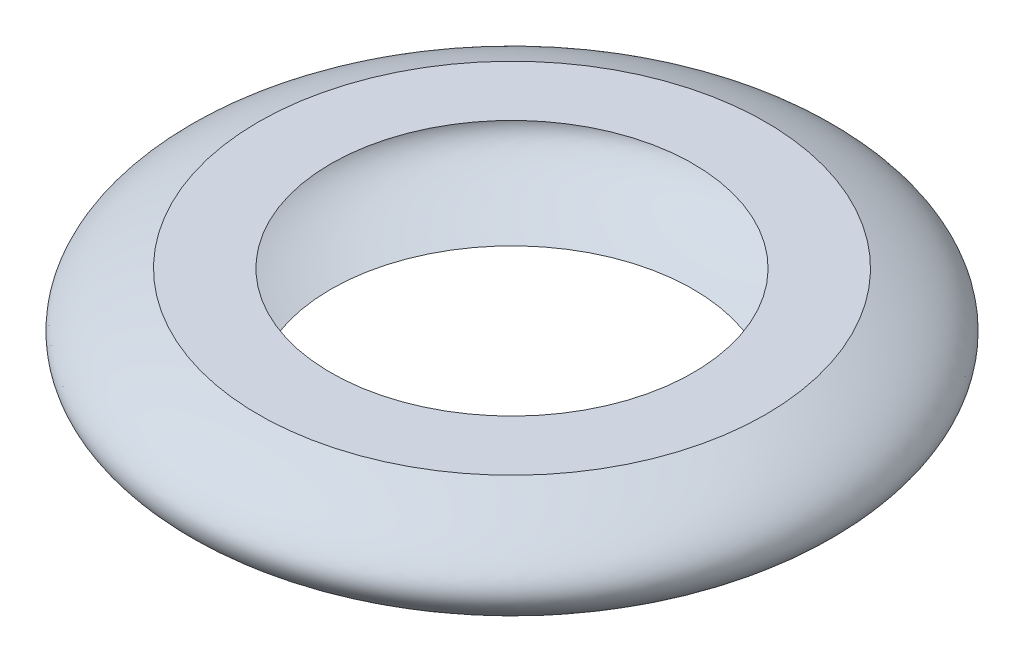
ISO-10303-21;
HEADER;
FILE_DESCRIPTION(('STEP AP214'),'2;1');
FILE_NAME('part.step','',(''),(''),'','','');
FILE_SCHEMA(('AUTOMOTIVE_DESIGN { 1 0 10303 214 1 1 1 1 }'));
ENDSEC;
DATA;
#1=APPLICATION_CONTEXT('core data for automotive mechanical design processes');
#2=APPLICATION_PROTOCOL_DEFINITION('international standard','automotive_design',2000,#1);
#3=PRODUCT_CONTEXT('',#1,'mechanical');
#4=PRODUCT('Part','Part','',(#3));
#5=PRODUCT_RELATED_PRODUCT_CATEGORY('part','',(#4));
#6=PRODUCT_DEFINITION_FORMATION('','',#4);
#7=PRODUCT_DEFINITION_CONTEXT('part definition',#1,'design');
#8=PRODUCT_DEFINITION('design','',#6,#7);
#9=PRODUCT_DEFINITION_SHAPE('','',#8);
#10=(LENGTH_UNIT() NAMED_UNIT(*) SI_UNIT(.MILLI.,.METRE.));
#11=(NAMED_UNIT(*) PLANE_ANGLE_UNIT() SI_UNIT($,.RADIAN.));
#12=(NAMED_UNIT(*) SI_UNIT($,.STERADIAN.) SOLID_ANGLE_UNIT());
#13=UNCERTAINTY_MEASURE_WITH_UNIT(LENGTH_MEASURE(1.E-05),#10,'distance_accuracy_value','');
#14=(GEOMETRIC_REPRESENTATION_CONTEXT(3) GLOBAL_UNCERTAINTY_ASSIGNED_CONTEXT((#13)) GLOBAL_UNIT_ASSIGNED_CONTEXT((#10,
#11,#12)) REPRESENTATION_CONTEXT('',''));
#15=CARTESIAN_POINT('',(0.,0.,0.));
#16=DIRECTION('',(0.,0.,1.));
#17=DIRECTION('',(1.,0.,0.));
#18=AXIS2_PLACEMENT_3D('',#15,#16,#17);
#19=CARTESIAN_POINT('',(-12.5,0.,0.));
#20=CARTESIAN_POINT('',(-23.,3.75,0.));
#21=CARTESIAN_POINT('',(-12.5,7.5,0.));
#22=B_SPLINE_CURVE_WITH_KNOTS('',2,(#19,#20,#21),.UNSPECIFIED.,.F.,.F.,(3,3),(0.,1.),.UNSPECIFIED.);
#23=CARTESIAN_POINT('',(0.,7.50000000000001,0.));
#24=DIRECTION('',(0.,1.,0.));
#25=AXIS1_PLACEMENT('',#23,#24);
#26=SURFACE_OF_REVOLUTION('',#22,#25);
#27=CARTESIAN_POINT('',(0.,7.50000000000001,0.));
#28=DIRECTION('',(0.,1.,0.));
#29=DIRECTION('',(-1.,0.,0.));
#30=AXIS2_PLACEMENT_3D('',#27,#28,#29);
#31=CIRCLE('',#30,12.5);
#32=CARTESIAN_POINT('',(-12.5,7.5,0.));
#33=VERTEX_POINT('',#32);
#34=EDGE_CURVE('E10',#33,#33,#31,.T.);
#35=ORIENTED_EDGE('',*,*,#34,.T.);
#36=EDGE_LOOP('',(#35));
#37=FACE_BOUND('',#36,.T.);
#38=CARTESIAN_POINT('',(0.,0.,0.));
#39=DIRECTION('',(0.,1.,0.));
#40=DIRECTION('',(-1.,0.,0.));
#41=AXIS2_PLACEMENT_3D('',#38,#39,#40);
#42=CIRCLE('',#41,12.5);
#43=CARTESIAN_POINT('',(-12.5,0.,0.));
#44=VERTEX_POINT('',#43);
#45=EDGE_CURVE('E55',#44,#44,#42,.T.);
#46=ORIENTED_EDGE('',*,*,#45,.F.);
#47=EDGE_LOOP('',(#46));
#48=FACE_BOUND('',#47,.T.);
#49=ADVANCED_FACE('F37',(#37,#48),#26,.F.);
#50=CARTESIAN_POINT('',(-12.5,7.49999999999999,0.));
#51=DIRECTION('',(0.,1.,0.));
#52=DIRECTION('',(-1.,0.,0.));
#53=AXIS2_PLACEMENT_3D('',#50,#51,#52);
#54=PLANE('',#53);
#55=CARTESIAN_POINT('',(0.,7.49999999999997,0.));
#56=DIRECTION('',(0.,1.,0.));
#57=DIRECTION('',(-1.,0.,0.));
#58=AXIS2_PLACEMENT_3D('',#55,#56,#57);
#59=CIRCLE('',#58,17.5);
#60=CARTESIAN_POINT('',(-17.5,7.49999999999997,0.));
#61=VERTEX_POINT('',#60);
#62=EDGE_CURVE('E45',#61,#61,#59,.T.);
#63=ORIENTED_EDGE('',*,*,#62,.T.);
#64=EDGE_LOOP('',(#63));
#65=FACE_BOUND('',#64,.T.);
#66=ORIENTED_EDGE('',*,*,#34,.F.);
#67=EDGE_LOOP('',(#66));
#68=FACE_BOUND('',#67,.T.);
#69=ADVANCED_FACE('F75',(#65,#68),#54,.T.);
#70=CARTESIAN_POINT('',(-17.5,7.49999999999997,0.));
#71=CARTESIAN_POINT('',(-28.,3.74999999999997,0.));
#72=CARTESIAN_POINT('',(-17.5,0.,0.));
#73=B_SPLINE_CURVE_WITH_KNOTS('',2,(#70,#71,#72),.UNSPECIFIED.,.F.,.F.,(3,3),(0.,1.),.UNSPECIFIED.);
#74=CARTESIAN_POINT('',(0.,7.50000000000001,0.));
#75=DIRECTION('',(0.,1.,0.));
#76=AXIS1_PLACEMENT('',#74,#75);
#77=SURFACE_OF_REVOLUTION('',#73,#76);
#78=CARTESIAN_POINT('',(0.,0.,0.));
#79=DIRECTION('',(0.,1.,0.));
#80=DIRECTION('',(-1.,0.,0.));
#81=AXIS2_PLACEMENT_3D('',#78,#79,#80);
#82=CIRCLE('',#81,17.5);
#83=CARTESIAN_POINT('',(-17.5,0.,0.));
#84=VERTEX_POINT('',#83);
#85=EDGE_CURVE('E50',#84,#84,#82,.T.);
#86=ORIENTED_EDGE('',*,*,#85,.T.);
#87=EDGE_LOOP('',(#86));
#88=FACE_BOUND('',#87,.T.);
#89=ORIENTED_EDGE('',*,*,#62,.F.);
#90=EDGE_LOOP('',(#89));
#91=FACE_BOUND('',#90,.T.);
#92=ADVANCED_FACE('F71',(#88,#91),#77,.F.);
#93=CARTESIAN_POINT('',(-12.5,0.,0.));
#94=DIRECTION('',(0.,-1.,0.));
#95=DIRECTION('',(1.,0.,0.));
#96=AXIS2_PLACEMENT_3D('',#93,#94,#95);
#97=PLANE('',#96);
#98=ORIENTED_EDGE('',*,*,#45,.T.);
#99=EDGE_LOOP('',(#98));
#100=FACE_BOUND('',#99,.T.);
#101=ORIENTED_EDGE('',*,*,#85,.F.);
#102=EDGE_LOOP('',(#101));
#103=FACE_BOUND('',#102,.T.);
#104=ADVANCED_FACE('F74',(#100,#103),#97,.T.);
#105=CLOSED_SHELL('',(#49,#69,#92,#104));
#106=MANIFOLD_SOLID_BREP('B2',#105);
#107=ADVANCED_BREP_SHAPE_REPRESENTATION('',(#18,#106),#14);
#108=SHAPE_DEFINITION_REPRESENTATION(#9,#107);
ENDSEC;
END-ISO-10303-21;
